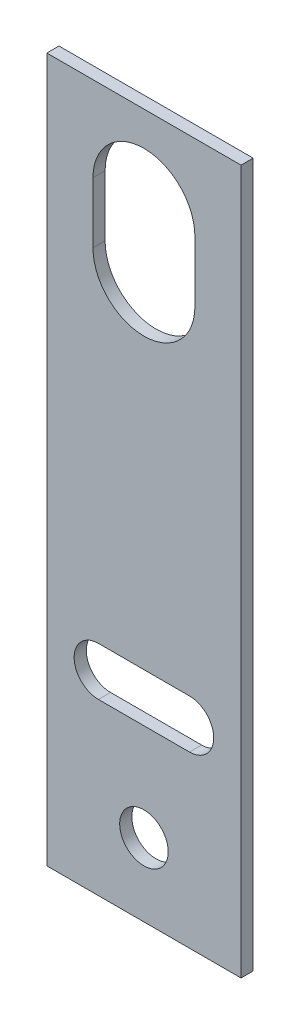
ISO-10303-21;
HEADER;
FILE_DESCRIPTION(('STEP AP214'),'2;1');
FILE_NAME('part.step','',(''),(''),'','','');
FILE_SCHEMA(('AUTOMOTIVE_DESIGN { 1 0 10303 214 1 1 1 1 }'));
ENDSEC;
DATA;
#1=APPLICATION_CONTEXT('core data for automotive mechanical design processes');
#2=APPLICATION_PROTOCOL_DEFINITION('international standard','automotive_design',2000,#1);
#3=PRODUCT_CONTEXT('',#1,'mechanical');
#4=PRODUCT('Part','Part','',(#3));
#5=PRODUCT_RELATED_PRODUCT_CATEGORY('part','',(#4));
#6=PRODUCT_DEFINITION_FORMATION('','',#4);
#7=PRODUCT_DEFINITION_CONTEXT('part definition',#1,'design');
#8=PRODUCT_DEFINITION('design','',#6,#7);
#9=PRODUCT_DEFINITION_SHAPE('','',#8);
#10=(LENGTH_UNIT() NAMED_UNIT(*) SI_UNIT(.MILLI.,.METRE.));
#11=(NAMED_UNIT(*) PLANE_ANGLE_UNIT() SI_UNIT($,.RADIAN.));
#12=(NAMED_UNIT(*) SI_UNIT($,.STERADIAN.) SOLID_ANGLE_UNIT());
#13=UNCERTAINTY_MEASURE_WITH_UNIT(LENGTH_MEASURE(1.E-05),#10,'distance_accuracy_value','');
#14=(GEOMETRIC_REPRESENTATION_CONTEXT(3) GLOBAL_UNCERTAINTY_ASSIGNED_CONTEXT((#13)) GLOBAL_UNIT_ASSIGNED_CONTEXT((#10,
#11,#12)) REPRESENTATION_CONTEXT('',''));
#15=CARTESIAN_POINT('',(0.,0.,0.));
#16=DIRECTION('',(0.,0.,1.));
#17=DIRECTION('',(1.,0.,0.));
#18=AXIS2_PLACEMENT_3D('',#15,#16,#17);
#19=CARTESIAN_POINT('',(0.,0.,0.));
#20=DIRECTION('',(0.,0.,-1.));
#21=DIRECTION('',(-1.,0.,0.));
#22=AXIS2_PLACEMENT_3D('',#19,#20,#21);
#23=PLANE('',#22);
#24=DIRECTION('',(1.,0.,0.));
#25=VECTOR('',#24,1.);
#26=CARTESIAN_POINT('',(-3.75,14.,0.));
#27=LINE('',#26,#25);
#28=CARTESIAN_POINT('',(3.75,14.,0.));
#29=VERTEX_POINT('',#28);
#30=CARTESIAN_POINT('',(-3.75,14.,0.));
#31=VERTEX_POINT('',#30);
#32=EDGE_CURVE('E118',#29,#31,#27,.F.);
#33=ORIENTED_EDGE('',*,*,#32,.F.);
#34=CARTESIAN_POINT('',(3.75,16.,0.));
#35=DIRECTION('',(0.,0.,-1.));
#36=DIRECTION('',(-1.,0.,0.));
#37=AXIS2_PLACEMENT_3D('',#34,#35,#36);
#38=CIRCLE('',#37,2.);
#39=CARTESIAN_POINT('',(3.75,18.,0.));
#40=VERTEX_POINT('',#39);
#41=EDGE_CURVE('E117',#29,#40,#38,.F.);
#42=ORIENTED_EDGE('',*,*,#41,.T.);
#43=DIRECTION('',(1.,0.,0.));
#44=VECTOR('',#43,1.);
#45=CARTESIAN_POINT('',(-3.75,18.,0.));
#46=LINE('',#45,#44);
#47=CARTESIAN_POINT('',(-3.75,18.,0.));
#48=VERTEX_POINT('',#47);
#49=EDGE_CURVE('E114',#48,#40,#46,.T.);
#50=ORIENTED_EDGE('',*,*,#49,.F.);
#51=CARTESIAN_POINT('',(-3.75,16.,0.));
#52=DIRECTION('',(0.,0.,-1.));
#53=DIRECTION('',(-1.,0.,0.));
#54=AXIS2_PLACEMENT_3D('',#51,#52,#53);
#55=CIRCLE('',#54,2.);
#56=EDGE_CURVE('E139',#48,#31,#55,.F.);
#57=ORIENTED_EDGE('',*,*,#56,.T.);
#58=EDGE_LOOP('',(#33,#42,#50,#57));
#59=FACE_BOUND('',#58,.T.);
#60=CARTESIAN_POINT('',(0.,6.,0.));
#61=DIRECTION('',(0.,0.,-1.));
#62=DIRECTION('',(-1.,0.,0.));
#63=AXIS2_PLACEMENT_3D('',#60,#61,#62);
#64=CIRCLE('',#63,2.);
#65=CARTESIAN_POINT('',(-2.,6.,0.));
#66=VERTEX_POINT('',#65);
#67=EDGE_CURVE('E19',#66,#66,#64,.F.);
#68=ORIENTED_EDGE('',*,*,#67,.T.);
#69=EDGE_LOOP('',(#68));
#70=FACE_BOUND('',#69,.T.);
#71=DIRECTION('',(0.,-1.,0.));
#72=VECTOR('',#71,1.);
#73=CARTESIAN_POINT('',(8.,0.,0.));
#74=LINE('',#73,#72);
#75=CARTESIAN_POINT('',(8.00000000000001,58.,0.));
#76=VERTEX_POINT('',#75);
#77=CARTESIAN_POINT('',(8.,0.,0.));
#78=VERTEX_POINT('',#77);
#79=EDGE_CURVE('E156',#76,#78,#74,.T.);
#80=ORIENTED_EDGE('',*,*,#79,.T.);
#81=DIRECTION('',(1.,0.,0.));
#82=VECTOR('',#81,1.);
#83=CARTESIAN_POINT('',(-8.,0.,0.));
#84=LINE('',#83,#82);
#85=CARTESIAN_POINT('',(-8.,0.,0.));
#86=VERTEX_POINT('',#85);
#87=EDGE_CURVE('E163',#78,#86,#84,.F.);
#88=ORIENTED_EDGE('',*,*,#87,.T.);
#89=DIRECTION('',(0.,1.,0.));
#90=VECTOR('',#89,1.);
#91=CARTESIAN_POINT('',(-8.,0.,0.));
#92=LINE('',#91,#90);
#93=CARTESIAN_POINT('',(-8.00000000000001,58.,0.));
#94=VERTEX_POINT('',#93);
#95=EDGE_CURVE('E121',#86,#94,#92,.T.);
#96=ORIENTED_EDGE('',*,*,#95,.T.);
#97=DIRECTION('',(1.,0.,0.));
#98=VECTOR('',#97,1.);
#99=CARTESIAN_POINT('',(-8.00000000000001,58.,0.));
#100=LINE('',#99,#98);
#101=EDGE_CURVE('E146',#94,#76,#100,.T.);
#102=ORIENTED_EDGE('',*,*,#101,.T.);
#103=EDGE_LOOP('',(#80,#88,#96,#102));
#104=FACE_BOUND('',#103,.T.);
#105=DIRECTION('',(0.,-1.,0.));
#106=VECTOR('',#105,1.);
#107=CARTESIAN_POINT('',(4.2,51.,0.));
#108=LINE('',#107,#106);
#109=CARTESIAN_POINT('',(4.2,51.,0.));
#110=VERTEX_POINT('',#109);
#111=CARTESIAN_POINT('',(4.2,46.,0.));
#112=VERTEX_POINT('',#111);
#113=EDGE_CURVE('E85',#110,#112,#108,.T.);
#114=ORIENTED_EDGE('',*,*,#113,.F.);
#115=CARTESIAN_POINT('',(0.,51.,0.));
#116=DIRECTION('',(0.,0.,-1.));
#117=DIRECTION('',(-1.,0.,0.));
#118=AXIS2_PLACEMENT_3D('',#115,#116,#117);
#119=CIRCLE('',#118,4.2);
#120=CARTESIAN_POINT('',(-4.2,51.,0.));
#121=VERTEX_POINT('',#120);
#122=EDGE_CURVE('E98',#110,#121,#119,.F.);
#123=ORIENTED_EDGE('',*,*,#122,.T.);
#124=DIRECTION('',(0.,1.,0.));
#125=VECTOR('',#124,1.);
#126=CARTESIAN_POINT('',(-4.2,51.,0.));
#127=LINE('',#126,#125);
#128=CARTESIAN_POINT('',(-4.2,46.,0.));
#129=VERTEX_POINT('',#128);
#130=EDGE_CURVE('E90',#129,#121,#127,.T.);
#131=ORIENTED_EDGE('',*,*,#130,.F.);
#132=CARTESIAN_POINT('',(0.,46.,0.));
#133=DIRECTION('',(0.,0.,-1.));
#134=DIRECTION('',(-1.,0.,0.));
#135=AXIS2_PLACEMENT_3D('',#132,#133,#134);
#136=CIRCLE('',#135,4.2);
#137=EDGE_CURVE('E145',#129,#112,#136,.F.);
#138=ORIENTED_EDGE('',*,*,#137,.T.);
#139=EDGE_LOOP('',(#114,#123,#131,#138));
#140=FACE_BOUND('',#139,.T.);
#141=ADVANCED_FACE('F16',(#59,#70,#104,#140),#23,.T.);
#142=CARTESIAN_POINT('',(0.,6.,1.));
#143=DIRECTION('',(0.,0.,-1.));
#144=DIRECTION('',(-1.,0.,0.));
#145=AXIS2_PLACEMENT_3D('',#142,#143,#144);
#146=CYLINDRICAL_SURFACE('',#145,2.);
#147=ORIENTED_EDGE('',*,*,#67,.F.);
#148=EDGE_LOOP('',(#147));
#149=FACE_BOUND('',#148,.T.);
#150=CARTESIAN_POINT('',(0.,6.,1.));
#151=DIRECTION('',(0.,0.,-1.));
#152=DIRECTION('',(-1.,0.,0.));
#153=AXIS2_PLACEMENT_3D('',#150,#151,#152);
#154=CIRCLE('',#153,2.);
#155=CARTESIAN_POINT('',(-2.,6.,1.));
#156=VERTEX_POINT('',#155);
#157=EDGE_CURVE('E136',#156,#156,#154,.F.);
#158=ORIENTED_EDGE('',*,*,#157,.T.);
#159=EDGE_LOOP('',(#158));
#160=FACE_BOUND('',#159,.T.);
#161=ADVANCED_FACE('F211',(#149,#160),#146,.F.);
#162=CARTESIAN_POINT('',(4.2,51.,1.));
#163=DIRECTION('',(-1.,0.,0.));
#164=DIRECTION('',(0.,-1.,0.));
#165=AXIS2_PLACEMENT_3D('',#162,#163,#164);
#166=PLANE('',#165);
#167=DIRECTION('',(0.,1.,0.));
#168=VECTOR('',#167,1.);
#169=CARTESIAN_POINT('',(4.2,0.,1.));
#170=LINE('',#169,#168);
#171=CARTESIAN_POINT('',(4.2,46.,1.));
#172=VERTEX_POINT('',#171);
#173=CARTESIAN_POINT('',(4.2,51.,1.));
#174=VERTEX_POINT('',#173);
#175=EDGE_CURVE('E135',#172,#174,#170,.T.);
#176=ORIENTED_EDGE('',*,*,#175,.T.);
#177=DIRECTION('',(0.,0.,-1.));
#178=VECTOR('',#177,1.);
#179=CARTESIAN_POINT('',(4.2,51.,1.));
#180=LINE('',#179,#178);
#181=EDGE_CURVE('E102',#174,#110,#180,.T.);
#182=ORIENTED_EDGE('',*,*,#181,.T.);
#183=ORIENTED_EDGE('',*,*,#113,.T.);
#184=DIRECTION('',(0.,0.,-1.));
#185=VECTOR('',#184,1.);
#186=CARTESIAN_POINT('',(4.2,46.,1.));
#187=LINE('',#186,#185);
#188=EDGE_CURVE('E107',#112,#172,#187,.F.);
#189=ORIENTED_EDGE('',*,*,#188,.T.);
#190=EDGE_LOOP('',(#176,#182,#183,#189));
#191=FACE_BOUND('',#190,.T.);
#192=ADVANCED_FACE('F342',(#191),#166,.T.);
#193=CARTESIAN_POINT('',(0.,51.,1.));
#194=DIRECTION('',(0.,0.,-1.));
#195=DIRECTION('',(-1.,0.,0.));
#196=AXIS2_PLACEMENT_3D('',#193,#194,#195);
#197=CYLINDRICAL_SURFACE('',#196,4.2);
#198=ORIENTED_EDGE('',*,*,#181,.F.);
#199=CARTESIAN_POINT('',(0.,51.,1.));
#200=DIRECTION('',(0.,0.,-1.));
#201=DIRECTION('',(-1.,0.,0.));
#202=AXIS2_PLACEMENT_3D('',#199,#200,#201);
#203=CIRCLE('',#202,4.2);
#204=CARTESIAN_POINT('',(-4.2,51.,1.));
#205=VERTEX_POINT('',#204);
#206=EDGE_CURVE('E106',#174,#205,#203,.F.);
#207=ORIENTED_EDGE('',*,*,#206,.T.);
#208=DIRECTION('',(0.,0.,1.));
#209=VECTOR('',#208,1.);
#210=CARTESIAN_POINT('',(-4.2,51.,1.));
#211=LINE('',#210,#209);
#212=EDGE_CURVE('E94',#121,#205,#211,.T.);
#213=ORIENTED_EDGE('',*,*,#212,.F.);
#214=ORIENTED_EDGE('',*,*,#122,.F.);
#215=EDGE_LOOP('',(#198,#207,#213,#214));
#216=FACE_BOUND('',#215,.T.);
#217=ADVANCED_FACE('F104',(#216),#197,.F.);
#218=CARTESIAN_POINT('',(-4.2,51.,1.));
#219=DIRECTION('',(1.,0.,0.));
#220=DIRECTION('',(0.,1.,0.));
#221=AXIS2_PLACEMENT_3D('',#218,#219,#220);
#222=PLANE('',#221);
#223=DIRECTION('',(0.,1.,0.));
#224=VECTOR('',#223,1.);
#225=CARTESIAN_POINT('',(-4.2,0.,1.));
#226=LINE('',#225,#224);
#227=CARTESIAN_POINT('',(-4.2,46.,1.));
#228=VERTEX_POINT('',#227);
#229=EDGE_CURVE('E133',#205,#228,#226,.F.);
#230=ORIENTED_EDGE('',*,*,#229,.T.);
#231=DIRECTION('',(0.,0.,-1.));
#232=VECTOR('',#231,1.);
#233=CARTESIAN_POINT('',(-4.2,46.,1.));
#234=LINE('',#233,#232);
#235=EDGE_CURVE('E96',#228,#129,#234,.T.);
#236=ORIENTED_EDGE('',*,*,#235,.T.);
#237=ORIENTED_EDGE('',*,*,#130,.T.);
#238=ORIENTED_EDGE('',*,*,#212,.T.);
#239=EDGE_LOOP('',(#230,#236,#237,#238));
#240=FACE_BOUND('',#239,.T.);
#241=ADVANCED_FACE('F92',(#240),#222,.T.);
#242=CARTESIAN_POINT('',(0.,46.,1.));
#243=DIRECTION('',(0.,0.,-1.));
#244=DIRECTION('',(-1.,0.,0.));
#245=AXIS2_PLACEMENT_3D('',#242,#243,#244);
#246=CYLINDRICAL_SURFACE('',#245,4.2);
#247=ORIENTED_EDGE('',*,*,#235,.F.);
#248=CARTESIAN_POINT('',(0.,46.,1.));
#249=DIRECTION('',(0.,0.,-1.));
#250=DIRECTION('',(-1.,0.,0.));
#251=AXIS2_PLACEMENT_3D('',#248,#249,#250);
#252=CIRCLE('',#251,4.2);
#253=EDGE_CURVE('E129',#228,#172,#252,.F.);
#254=ORIENTED_EDGE('',*,*,#253,.T.);
#255=ORIENTED_EDGE('',*,*,#188,.F.);
#256=ORIENTED_EDGE('',*,*,#137,.F.);
#257=EDGE_LOOP('',(#247,#254,#255,#256));
#258=FACE_BOUND('',#257,.T.);
#259=ADVANCED_FACE('F319',(#258),#246,.F.);
#260=CARTESIAN_POINT('',(-8.00000000000001,58.,1.));
#261=DIRECTION('',(0.,-1.,0.));
#262=DIRECTION('',(0.,0.,-1.));
#263=AXIS2_PLACEMENT_3D('',#260,#261,#262);
#264=PLANE('',#263);
#265=DIRECTION('',(0.,0.,1.));
#266=VECTOR('',#265,1.);
#267=CARTESIAN_POINT('',(-8.00000000000001,58.,1.));
#268=LINE('',#267,#266);
#269=CARTESIAN_POINT('',(-8.00000000000001,58.,1.));
#270=VERTEX_POINT('',#269);
#271=EDGE_CURVE('E166',#94,#270,#268,.T.);
#272=ORIENTED_EDGE('',*,*,#271,.T.);
#273=DIRECTION('',(-1.,0.,0.));
#274=VECTOR('',#273,1.);
#275=CARTESIAN_POINT('',(0.,58.,1.));
#276=LINE('',#275,#274);
#277=CARTESIAN_POINT('',(8.00000000000001,58.,1.));
#278=VERTEX_POINT('',#277);
#279=EDGE_CURVE('E132',#270,#278,#276,.F.);
#280=ORIENTED_EDGE('',*,*,#279,.T.);
#281=DIRECTION('',(0.,0.,1.));
#282=VECTOR('',#281,1.);
#283=CARTESIAN_POINT('',(8.00000000000001,58.,1.));
#284=LINE('',#283,#282);
#285=EDGE_CURVE('E148',#278,#76,#284,.F.);
#286=ORIENTED_EDGE('',*,*,#285,.T.);
#287=ORIENTED_EDGE('',*,*,#101,.F.);
#288=EDGE_LOOP('',(#272,#280,#286,#287));
#289=FACE_BOUND('',#288,.T.);
#290=ADVANCED_FACE('F235',(#289),#264,.F.);
#291=CARTESIAN_POINT('',(8.,0.,1.));
#292=DIRECTION('',(-1.,0.,0.));
#293=DIRECTION('',(0.,-1.,0.));
#294=AXIS2_PLACEMENT_3D('',#291,#292,#293);
#295=PLANE('',#294);
#296=ORIENTED_EDGE('',*,*,#285,.F.);
#297=DIRECTION('',(0.,1.,0.));
#298=VECTOR('',#297,1.);
#299=CARTESIAN_POINT('',(8.00000000000001,0.,1.));
#300=LINE('',#299,#298);
#301=CARTESIAN_POINT('',(8.,0.,1.));
#302=VERTEX_POINT('',#301);
#303=EDGE_CURVE('E184',#278,#302,#300,.F.);
#304=ORIENTED_EDGE('',*,*,#303,.T.);
#305=DIRECTION('',(0.,0.,1.));
#306=VECTOR('',#305,1.);
#307=CARTESIAN_POINT('',(8.,0.,1.));
#308=LINE('',#307,#306);
#309=EDGE_CURVE('E160',#302,#78,#308,.F.);
#310=ORIENTED_EDGE('',*,*,#309,.T.);
#311=ORIENTED_EDGE('',*,*,#79,.F.);
#312=EDGE_LOOP('',(#296,#304,#310,#311));
#313=FACE_BOUND('',#312,.T.);
#314=ADVANCED_FACE('F226',(#313),#295,.F.);
#315=CARTESIAN_POINT('',(-8.,0.,1.));
#316=DIRECTION('',(0.,1.,0.));
#317=DIRECTION('',(0.,0.,1.));
#318=AXIS2_PLACEMENT_3D('',#315,#316,#317);
#319=PLANE('',#318);
#320=ORIENTED_EDGE('',*,*,#309,.F.);
#321=DIRECTION('',(-1.,0.,0.));
#322=VECTOR('',#321,1.);
#323=CARTESIAN_POINT('',(0.,0.,1.));
#324=LINE('',#323,#322);
#325=CARTESIAN_POINT('',(-8.,0.,1.));
#326=VERTEX_POINT('',#325);
#327=EDGE_CURVE('E187',#302,#326,#324,.T.);
#328=ORIENTED_EDGE('',*,*,#327,.T.);
#329=DIRECTION('',(0.,0.,1.));
#330=VECTOR('',#329,1.);
#331=CARTESIAN_POINT('',(-8.,0.,1.));
#332=LINE('',#331,#330);
#333=EDGE_CURVE('E169',#326,#86,#332,.F.);
#334=ORIENTED_EDGE('',*,*,#333,.T.);
#335=ORIENTED_EDGE('',*,*,#87,.F.);
#336=EDGE_LOOP('',(#320,#328,#334,#335));
#337=FACE_BOUND('',#336,.T.);
#338=ADVANCED_FACE('F222',(#337),#319,.F.);
#339=CARTESIAN_POINT('',(-8.,0.,1.));
#340=DIRECTION('',(1.,0.,0.));
#341=DIRECTION('',(0.,1.,0.));
#342=AXIS2_PLACEMENT_3D('',#339,#340,#341);
#343=PLANE('',#342);
#344=ORIENTED_EDGE('',*,*,#333,.F.);
#345=DIRECTION('',(0.,1.,0.));
#346=VECTOR('',#345,1.);
#347=CARTESIAN_POINT('',(-8.,0.,1.));
#348=LINE('',#347,#346);
#349=EDGE_CURVE('E128',#326,#270,#348,.T.);
#350=ORIENTED_EDGE('',*,*,#349,.T.);
#351=ORIENTED_EDGE('',*,*,#271,.F.);
#352=ORIENTED_EDGE('',*,*,#95,.F.);
#353=EDGE_LOOP('',(#344,#350,#351,#352));
#354=FACE_BOUND('',#353,.T.);
#355=ADVANCED_FACE('F239',(#354),#343,.F.);
#356=CARTESIAN_POINT('',(-3.75,14.,1.));
#357=DIRECTION('',(0.,1.,0.));
#358=DIRECTION('',(0.,0.,1.));
#359=AXIS2_PLACEMENT_3D('',#356,#357,#358);
#360=PLANE('',#359);
#361=DIRECTION('',(-1.,0.,0.));
#362=VECTOR('',#361,1.);
#363=CARTESIAN_POINT('',(0.,14.,1.));
#364=LINE('',#363,#362);
#365=CARTESIAN_POINT('',(-3.75,14.,1.));
#366=VERTEX_POINT('',#365);
#367=CARTESIAN_POINT('',(3.75,14.,1.));
#368=VERTEX_POINT('',#367);
#369=EDGE_CURVE('E126',#366,#368,#364,.F.);
#370=ORIENTED_EDGE('',*,*,#369,.T.);
#371=DIRECTION('',(0.,0.,-1.));
#372=VECTOR('',#371,1.);
#373=CARTESIAN_POINT('',(3.75,14.,1.));
#374=LINE('',#373,#372);
#375=EDGE_CURVE('E144',#368,#29,#374,.T.);
#376=ORIENTED_EDGE('',*,*,#375,.T.);
#377=ORIENTED_EDGE('',*,*,#32,.T.);
#378=DIRECTION('',(0.,0.,1.));
#379=VECTOR('',#378,1.);
#380=CARTESIAN_POINT('',(-3.75,14.,1.));
#381=LINE('',#380,#379);
#382=EDGE_CURVE('E120',#31,#366,#381,.T.);
#383=ORIENTED_EDGE('',*,*,#382,.T.);
#384=EDGE_LOOP('',(#370,#376,#377,#383));
#385=FACE_BOUND('',#384,.T.);
#386=ADVANCED_FACE('F194',(#385),#360,.T.);
#387=CARTESIAN_POINT('',(3.75,16.,1.));
#388=DIRECTION('',(0.,0.,-1.));
#389=DIRECTION('',(-1.,0.,0.));
#390=AXIS2_PLACEMENT_3D('',#387,#388,#389);
#391=CYLINDRICAL_SURFACE('',#390,2.);
#392=ORIENTED_EDGE('',*,*,#375,.F.);
#393=CARTESIAN_POINT('',(3.75,16.,1.));
#394=DIRECTION('',(0.,0.,-1.));
#395=DIRECTION('',(-1.,0.,0.));
#396=AXIS2_PLACEMENT_3D('',#393,#394,#395);
#397=CIRCLE('',#396,2.);
#398=CARTESIAN_POINT('',(3.75,18.,1.));
#399=VERTEX_POINT('',#398);
#400=EDGE_CURVE('E25',#368,#399,#397,.F.);
#401=ORIENTED_EDGE('',*,*,#400,.T.);
#402=DIRECTION('',(0.,0.,-1.));
#403=VECTOR('',#402,1.);
#404=CARTESIAN_POINT('',(3.75,18.,1.));
#405=LINE('',#404,#403);
#406=EDGE_CURVE('E116',#40,#399,#405,.F.);
#407=ORIENTED_EDGE('',*,*,#406,.F.);
#408=ORIENTED_EDGE('',*,*,#41,.F.);
#409=EDGE_LOOP('',(#392,#401,#407,#408));
#410=FACE_BOUND('',#409,.T.);
#411=ADVANCED_FACE('F206',(#410),#391,.F.);
#412=CARTESIAN_POINT('',(-3.75,18.,1.));
#413=DIRECTION('',(0.,-1.,0.));
#414=DIRECTION('',(0.,0.,-1.));
#415=AXIS2_PLACEMENT_3D('',#412,#413,#414);
#416=PLANE('',#415);
#417=DIRECTION('',(-1.,0.,0.));
#418=VECTOR('',#417,1.);
#419=CARTESIAN_POINT('',(0.,18.,1.));
#420=LINE('',#419,#418);
#421=CARTESIAN_POINT('',(-3.75,18.,1.));
#422=VERTEX_POINT('',#421);
#423=EDGE_CURVE('E11',#399,#422,#420,.T.);
#424=ORIENTED_EDGE('',*,*,#423,.T.);
#425=DIRECTION('',(0.,0.,-1.));
#426=VECTOR('',#425,1.);
#427=CARTESIAN_POINT('',(-3.75,18.,1.));
#428=LINE('',#427,#426);
#429=EDGE_CURVE('E141',#422,#48,#428,.T.);
#430=ORIENTED_EDGE('',*,*,#429,.T.);
#431=ORIENTED_EDGE('',*,*,#49,.T.);
#432=ORIENTED_EDGE('',*,*,#406,.T.);
#433=EDGE_LOOP('',(#424,#430,#431,#432));
#434=FACE_BOUND('',#433,.T.);
#435=ADVANCED_FACE('F203',(#434),#416,.T.);
#436=CARTESIAN_POINT('',(-3.75,16.,1.));
#437=DIRECTION('',(0.,0.,-1.));
#438=DIRECTION('',(-1.,0.,0.));
#439=AXIS2_PLACEMENT_3D('',#436,#437,#438);
#440=CYLINDRICAL_SURFACE('',#439,2.);
#441=ORIENTED_EDGE('',*,*,#429,.F.);
#442=CARTESIAN_POINT('',(-3.75,16.,1.));
#443=DIRECTION('',(0.,0.,-1.));
#444=DIRECTION('',(-1.,0.,0.));
#445=AXIS2_PLACEMENT_3D('',#442,#443,#444);
#446=CIRCLE('',#445,2.);
#447=EDGE_CURVE('E34',#422,#366,#446,.F.);
#448=ORIENTED_EDGE('',*,*,#447,.T.);
#449=ORIENTED_EDGE('',*,*,#382,.F.);
#450=ORIENTED_EDGE('',*,*,#56,.F.);
#451=EDGE_LOOP('',(#441,#448,#449,#450));
#452=FACE_BOUND('',#451,.T.);
#453=ADVANCED_FACE('F200',(#452),#440,.F.);
#454=CARTESIAN_POINT('',(0.,0.,1.));
#455=DIRECTION('',(0.,0.,-1.));
#456=DIRECTION('',(-1.,0.,0.));
#457=AXIS2_PLACEMENT_3D('',#454,#455,#456);
#458=PLANE('',#457);
#459=ORIENTED_EDGE('',*,*,#423,.F.);
#460=ORIENTED_EDGE('',*,*,#400,.F.);
#461=ORIENTED_EDGE('',*,*,#369,.F.);
#462=ORIENTED_EDGE('',*,*,#447,.F.);
#463=EDGE_LOOP('',(#459,#460,#461,#462));
#464=FACE_BOUND('',#463,.T.);
#465=ORIENTED_EDGE('',*,*,#327,.F.);
#466=ORIENTED_EDGE('',*,*,#303,.F.);
#467=ORIENTED_EDGE('',*,*,#279,.F.);
#468=ORIENTED_EDGE('',*,*,#349,.F.);
#469=EDGE_LOOP('',(#465,#466,#467,#468));
#470=FACE_BOUND('',#469,.T.);
#471=ORIENTED_EDGE('',*,*,#229,.F.);
#472=ORIENTED_EDGE('',*,*,#206,.F.);
#473=ORIENTED_EDGE('',*,*,#175,.F.);
#474=ORIENTED_EDGE('',*,*,#253,.F.);
#475=EDGE_LOOP('',(#471,#472,#473,#474));
#476=FACE_BOUND('',#475,.T.);
#477=ORIENTED_EDGE('',*,*,#157,.F.);
#478=EDGE_LOOP('',(#477));
#479=FACE_BOUND('',#478,.T.);
#480=ADVANCED_FACE('F197',(#464,#470,#476,#479),#458,.F.);
#481=CLOSED_SHELL('',(#141,#161,#192,#217,#241,#259,#290,#314,#338,#355,#386,#411,#435,#453,#480));
#482=MANIFOLD_SOLID_BREP('B1',#481);
#483=ADVANCED_BREP_SHAPE_REPRESENTATION('',(#18,#482),#14);
#484=SHAPE_DEFINITION_REPRESENTATION(#9,#483);
ENDSEC;
END-ISO-10303-21;
